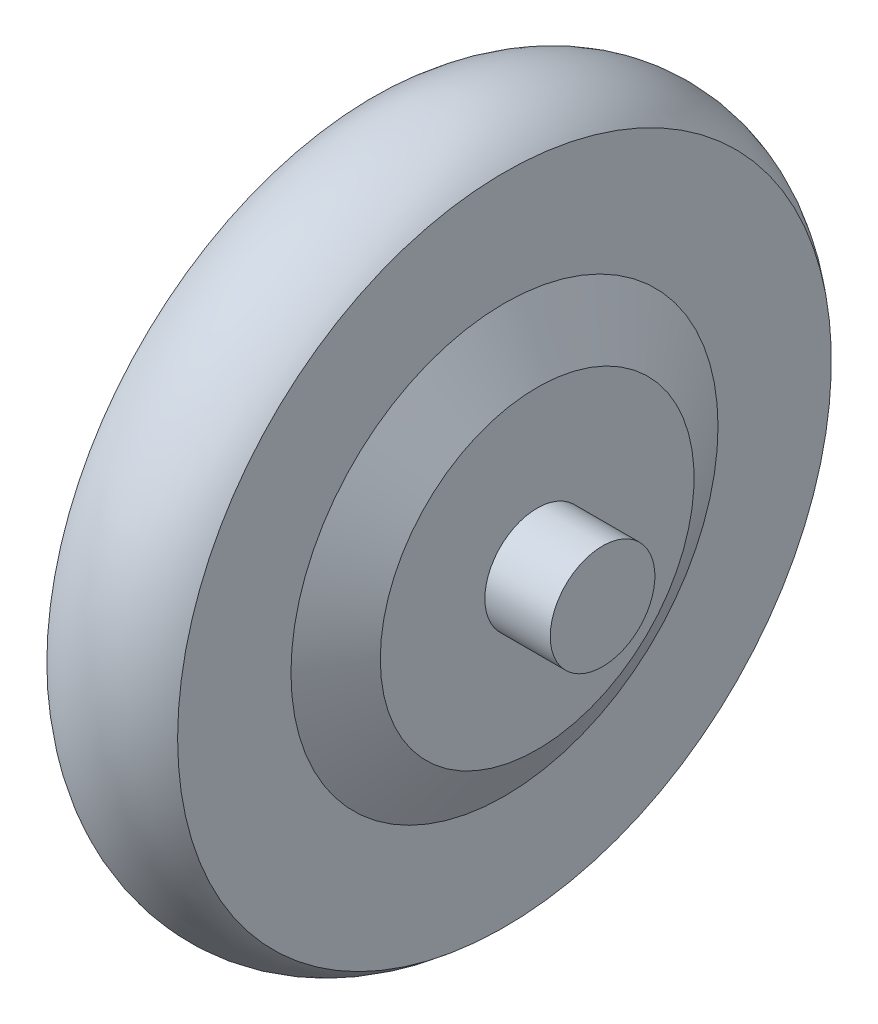
ISO-10303-21;
HEADER;
FILE_DESCRIPTION(('STEP AP214'),'2;1');
FILE_NAME('part.step','',(''),(''),'','','');
FILE_SCHEMA(('AUTOMOTIVE_DESIGN { 1 0 10303 214 1 1 1 1 }'));
ENDSEC;
DATA;
#1=APPLICATION_CONTEXT('core data for automotive mechanical design processes');
#2=APPLICATION_PROTOCOL_DEFINITION('international standard','automotive_design',2000,#1);
#3=PRODUCT_CONTEXT('',#1,'mechanical');
#4=PRODUCT('Part','Part','',(#3));
#5=PRODUCT_RELATED_PRODUCT_CATEGORY('part','',(#4));
#6=PRODUCT_DEFINITION_FORMATION('','',#4);
#7=PRODUCT_DEFINITION_CONTEXT('part definition',#1,'design');
#8=PRODUCT_DEFINITION('design','',#6,#7);
#9=PRODUCT_DEFINITION_SHAPE('','',#8);
#10=(LENGTH_UNIT() NAMED_UNIT(*) SI_UNIT(.MILLI.,.METRE.));
#11=(NAMED_UNIT(*) PLANE_ANGLE_UNIT() SI_UNIT($,.RADIAN.));
#12=(NAMED_UNIT(*) SI_UNIT($,.STERADIAN.) SOLID_ANGLE_UNIT());
#13=UNCERTAINTY_MEASURE_WITH_UNIT(LENGTH_MEASURE(1.E-05),#10,'distance_accuracy_value','');
#14=(GEOMETRIC_REPRESENTATION_CONTEXT(3) GLOBAL_UNCERTAINTY_ASSIGNED_CONTEXT((#13)) GLOBAL_UNIT_ASSIGNED_CONTEXT((#10,
#11,#12)) REPRESENTATION_CONTEXT('',''));
#15=CARTESIAN_POINT('',(0.,0.,0.));
#16=DIRECTION('',(0.,0.,1.));
#17=DIRECTION('',(1.,0.,0.));
#18=AXIS2_PLACEMENT_3D('',#15,#16,#17);
#19=CARTESIAN_POINT('',(0.,0.,0.));
#20=DIRECTION('',(-1.,0.,0.));
#21=DIRECTION('',(0.,0.,1.));
#22=AXIS2_PLACEMENT_3D('',#19,#20,#21);
#23=CYLINDRICAL_SURFACE('',#22,12.);
#24=CARTESIAN_POINT('',(-5.,0.,0.));
#25=DIRECTION('',(-1.,0.,0.));
#26=DIRECTION('',(0.,0.,1.));
#27=AXIS2_PLACEMENT_3D('',#24,#25,#26);
#28=CIRCLE('',#27,12.);
#29=CARTESIAN_POINT('',(-5.,0.,12.));
#30=VERTEX_POINT('',#29);
#31=EDGE_CURVE('E110',#30,#30,#28,.T.);
#32=ORIENTED_EDGE('',*,*,#31,.T.);
#33=EDGE_LOOP('',(#32));
#34=FACE_BOUND('',#33,.T.);
#35=CARTESIAN_POINT('',(-13.,0.,0.));
#36=DIRECTION('',(-1.,0.,0.));
#37=DIRECTION('',(0.,0.,1.));
#38=AXIS2_PLACEMENT_3D('',#35,#36,#37);
#39=CIRCLE('',#38,12.);
#40=CARTESIAN_POINT('',(-13.,0.,12.));
#41=VERTEX_POINT('',#40);
#42=EDGE_CURVE('E107',#41,#41,#39,.T.);
#43=ORIENTED_EDGE('',*,*,#42,.F.);
#44=EDGE_LOOP('',(#43));
#45=FACE_BOUND('',#44,.T.);
#46=CARTESIAN_POINT('',(-6.8,0.,0.));
#47=DIRECTION('',(-1.,0.,0.));
#48=DIRECTION('',(0.,0.,1.));
#49=AXIS2_PLACEMENT_3D('',#46,#47,#48);
#50=CIRCLE('',#49,12.);
#51=CARTESIAN_POINT('',(-6.8,11.3137084989848,4.));
#52=VERTEX_POINT('',#51);
#53=CARTESIAN_POINT('',(-6.8,11.3137084989848,-4.));
#54=VERTEX_POINT('',#53);
#55=EDGE_CURVE('E11',#52,#54,#50,.T.);
#56=ORIENTED_EDGE('',*,*,#55,.F.);
#57=DIRECTION('',(-1.,0.,0.));
#58=VECTOR('',#57,1.);
#59=CARTESIAN_POINT('',(0.,11.3137084989848,4.));
#60=LINE('',#59,#58);
#61=CARTESIAN_POINT('',(-11.2,11.3137084989848,4.));
#62=VERTEX_POINT('',#61);
#63=EDGE_CURVE('E131',#62,#52,#60,.F.);
#64=ORIENTED_EDGE('',*,*,#63,.F.);
#65=CARTESIAN_POINT('',(-11.2,0.,0.));
#66=DIRECTION('',(1.,0.,0.));
#67=DIRECTION('',(0.,0.,-1.));
#68=AXIS2_PLACEMENT_3D('',#65,#66,#67);
#69=CIRCLE('',#68,12.);
#70=CARTESIAN_POINT('',(-11.2,11.3137084989848,-4.));
#71=VERTEX_POINT('',#70);
#72=EDGE_CURVE('E52',#71,#62,#69,.T.);
#73=ORIENTED_EDGE('',*,*,#72,.F.);
#74=DIRECTION('',(-1.,0.,0.));
#75=VECTOR('',#74,1.);
#76=CARTESIAN_POINT('',(0.,11.3137084989848,-4.));
#77=LINE('',#76,#75);
#78=EDGE_CURVE('E42',#54,#71,#77,.T.);
#79=ORIENTED_EDGE('',*,*,#78,.F.);
#80=EDGE_LOOP('',(#56,#64,#73,#79));
#81=FACE_BOUND('',#80,.T.);
#82=ADVANCED_FACE('F34',(#34,#45,#81),#23,.T.);
#83=CARTESIAN_POINT('',(-13.,0.,0.));
#84=DIRECTION('',(1.,0.,0.));
#85=DIRECTION('',(0.,0.,-1.));
#86=AXIS2_PLACEMENT_3D('',#83,#84,#85);
#87=PLANE('',#86);
#88=CARTESIAN_POINT('',(-13.,0.,0.));
#89=DIRECTION('',(1.,0.,0.));
#90=DIRECTION('',(0.,0.,-1.));
#91=AXIS2_PLACEMENT_3D('',#88,#89,#90);
#92=CIRCLE('',#91,8.);
#93=CARTESIAN_POINT('',(-13.,0.,-8.));
#94=VERTEX_POINT('',#93);
#95=EDGE_CURVE('E104',#94,#94,#92,.T.);
#96=ORIENTED_EDGE('',*,*,#95,.T.);
#97=EDGE_LOOP('',(#96));
#98=FACE_BOUND('',#97,.T.);
#99=ORIENTED_EDGE('',*,*,#42,.T.);
#100=EDGE_LOOP('',(#99));
#101=FACE_BOUND('',#100,.T.);
#102=ADVANCED_FACE('F36',(#98,#101),#87,.F.);
#103=CARTESIAN_POINT('',(25.,0.,0.));
#104=DIRECTION('',(-1.,0.,0.));
#105=DIRECTION('',(0.,0.,1.));
#106=AXIS2_PLACEMENT_3D('',#103,#104,#105);
#107=PLANE('',#106);
#108=CARTESIAN_POINT('',(25.,0.,0.));
#109=DIRECTION('',(-1.,0.,0.));
#110=DIRECTION('',(0.,0.,1.));
#111=AXIS2_PLACEMENT_3D('',#108,#109,#110);
#112=CIRCLE('',#111,8.);
#113=CARTESIAN_POINT('',(25.,0.,8.));
#114=VERTEX_POINT('',#113);
#115=EDGE_CURVE('E103',#114,#114,#112,.T.);
#116=ORIENTED_EDGE('',*,*,#115,.T.);
#117=EDGE_LOOP('',(#116));
#118=FACE_BOUND('',#117,.T.);
#119=CARTESIAN_POINT('',(25.,0.,0.));
#120=DIRECTION('',(-1.,0.,0.));
#121=DIRECTION('',(0.,0.,1.));
#122=AXIS2_PLACEMENT_3D('',#119,#120,#121);
#123=CIRCLE('',#122,24.);
#124=CARTESIAN_POINT('',(25.,0.,24.));
#125=VERTEX_POINT('',#124);
#126=EDGE_CURVE('E128',#125,#125,#123,.T.);
#127=ORIENTED_EDGE('',*,*,#126,.F.);
#128=EDGE_LOOP('',(#127));
#129=FACE_BOUND('',#128,.T.);
#130=ADVANCED_FACE('F154',(#118,#129),#107,.F.);
#131=CARTESIAN_POINT('',(25.,0.,0.));
#132=DIRECTION('',(-1.,0.,0.));
#133=DIRECTION('',(0.,0.,1.));
#134=AXIS2_PLACEMENT_3D('',#131,#132,#133);
#135=CONICAL_SURFACE('',#134,24.,1.04719755119659);
#136=CARTESIAN_POINT('',(20.,0.,0.));
#137=DIRECTION('',(-1.,0.,0.));
#138=DIRECTION('',(0.,0.,1.));
#139=AXIS2_PLACEMENT_3D('',#136,#137,#138);
#140=CIRCLE('',#139,32.6602540378443);
#141=CARTESIAN_POINT('',(20.,0.,32.6602540378443));
#142=VERTEX_POINT('',#141);
#143=EDGE_CURVE('E125',#142,#142,#140,.T.);
#144=ORIENTED_EDGE('',*,*,#143,.F.);
#145=EDGE_LOOP('',(#144));
#146=FACE_BOUND('',#145,.T.);
#147=ORIENTED_EDGE('',*,*,#126,.T.);
#148=EDGE_LOOP('',(#147));
#149=FACE_BOUND('',#148,.T.);
#150=ADVANCED_FACE('F181',(#146,#149),#135,.T.);
#151=CARTESIAN_POINT('',(20.,32.6602540378443,0.));
#152=DIRECTION('',(-1.,0.,0.));
#153=DIRECTION('',(0.,0.,1.));
#154=AXIS2_PLACEMENT_3D('',#151,#152,#153);
#155=PLANE('',#154);
#156=CARTESIAN_POINT('',(20.,0.,0.));
#157=DIRECTION('',(-1.,0.,0.));
#158=DIRECTION('',(0.,0.,1.));
#159=AXIS2_PLACEMENT_3D('',#156,#157,#158);
#160=CIRCLE('',#159,50.);
#161=CARTESIAN_POINT('',(20.,0.,50.));
#162=VERTEX_POINT('',#161);
#163=EDGE_CURVE('E122',#162,#162,#160,.T.);
#164=ORIENTED_EDGE('',*,*,#163,.F.);
#165=EDGE_LOOP('',(#164));
#166=FACE_BOUND('',#165,.T.);
#167=ORIENTED_EDGE('',*,*,#143,.T.);
#168=EDGE_LOOP('',(#167));
#169=FACE_BOUND('',#168,.T.);
#170=ADVANCED_FACE('F177',(#166,#169),#155,.F.);
#171=CARTESIAN_POINT('',(10.,0.,0.));
#172=DIRECTION('',(-1.,0.,0.));
#173=DIRECTION('',(0.,0.,1.));
#174=AXIS2_PLACEMENT_3D('',#171,#172,#173);
#175=TOROIDAL_SURFACE('',#174,38.8196601125011,15.);
#176=CARTESIAN_POINT('',(0.,0.,0.));
#177=DIRECTION('',(-1.,0.,0.));
#178=DIRECTION('',(0.,0.,1.));
#179=AXIS2_PLACEMENT_3D('',#176,#177,#178);
#180=CIRCLE('',#179,50.);
#181=CARTESIAN_POINT('',(0.,0.,50.));
#182=VERTEX_POINT('',#181);
#183=EDGE_CURVE('E119',#182,#182,#180,.T.);
#184=ORIENTED_EDGE('',*,*,#183,.F.);
#185=EDGE_LOOP('',(#184));
#186=FACE_BOUND('',#185,.T.);
#187=ORIENTED_EDGE('',*,*,#163,.T.);
#188=EDGE_LOOP('',(#187));
#189=FACE_BOUND('',#188,.T.);
#190=ADVANCED_FACE('F173',(#186,#189),#175,.T.);
#191=CARTESIAN_POINT('',(0.,32.6602540378443,0.));
#192=DIRECTION('',(1.,0.,0.));
#193=DIRECTION('',(0.,0.,-1.));
#194=AXIS2_PLACEMENT_3D('',#191,#192,#193);
#195=PLANE('',#194);
#196=CARTESIAN_POINT('',(0.,0.,0.));
#197=DIRECTION('',(-1.,0.,0.));
#198=DIRECTION('',(0.,0.,1.));
#199=AXIS2_PLACEMENT_3D('',#196,#197,#198);
#200=CIRCLE('',#199,32.6602540378443);
#201=CARTESIAN_POINT('',(0.,0.,32.6602540378443));
#202=VERTEX_POINT('',#201);
#203=EDGE_CURVE('E116',#202,#202,#200,.T.);
#204=ORIENTED_EDGE('',*,*,#203,.F.);
#205=EDGE_LOOP('',(#204));
#206=FACE_BOUND('',#205,.T.);
#207=ORIENTED_EDGE('',*,*,#183,.T.);
#208=EDGE_LOOP('',(#207));
#209=FACE_BOUND('',#208,.T.);
#210=ADVANCED_FACE('F169',(#206,#209),#195,.F.);
#211=CARTESIAN_POINT('',(0.,0.,0.));
#212=DIRECTION('',(1.,0.,0.));
#213=DIRECTION('',(0.,0.,-1.));
#214=AXIS2_PLACEMENT_3D('',#211,#212,#213);
#215=CONICAL_SURFACE('',#214,32.6602540378443,1.04719755119659);
#216=CARTESIAN_POINT('',(-5.,0.,0.));
#217=DIRECTION('',(-1.,0.,0.));
#218=DIRECTION('',(0.,0.,1.));
#219=AXIS2_PLACEMENT_3D('',#216,#217,#218);
#220=CIRCLE('',#219,24.);
#221=CARTESIAN_POINT('',(-5.,0.,24.));
#222=VERTEX_POINT('',#221);
#223=EDGE_CURVE('E113',#222,#222,#220,.T.);
#224=ORIENTED_EDGE('',*,*,#223,.F.);
#225=EDGE_LOOP('',(#224));
#226=FACE_BOUND('',#225,.T.);
#227=ORIENTED_EDGE('',*,*,#203,.T.);
#228=EDGE_LOOP('',(#227));
#229=FACE_BOUND('',#228,.T.);
#230=ADVANCED_FACE('F165',(#226,#229),#215,.T.);
#231=CARTESIAN_POINT('',(-5.,12.,0.));
#232=DIRECTION('',(1.,0.,0.));
#233=DIRECTION('',(0.,0.,-1.));
#234=AXIS2_PLACEMENT_3D('',#231,#232,#233);
#235=PLANE('',#234);
#236=ORIENTED_EDGE('',*,*,#31,.F.);
#237=EDGE_LOOP('',(#236));
#238=FACE_BOUND('',#237,.T.);
#239=ORIENTED_EDGE('',*,*,#223,.T.);
#240=EDGE_LOOP('',(#239));
#241=FACE_BOUND('',#240,.T.);
#242=ADVANCED_FACE('F161',(#238,#241),#235,.F.);
#243=CARTESIAN_POINT('',(35.,0.,0.));
#244=DIRECTION('',(-1.,0.,0.));
#245=DIRECTION('',(0.,0.,1.));
#246=AXIS2_PLACEMENT_3D('',#243,#244,#245);
#247=PLANE('',#246);
#248=CARTESIAN_POINT('',(35.,0.,0.));
#249=DIRECTION('',(-1.,0.,0.));
#250=DIRECTION('',(0.,0.,1.));
#251=AXIS2_PLACEMENT_3D('',#248,#249,#250);
#252=CIRCLE('',#251,8.);
#253=CARTESIAN_POINT('',(35.,0.,8.));
#254=VERTEX_POINT('',#253);
#255=EDGE_CURVE('E95',#254,#254,#252,.T.);
#256=ORIENTED_EDGE('',*,*,#255,.F.);
#257=EDGE_LOOP('',(#256));
#258=FACE_BOUND('',#257,.T.);
#259=ADVANCED_FACE('F164',(#258),#247,.F.);
#260=CARTESIAN_POINT('',(35.,0.,0.));
#261=DIRECTION('',(-1.,0.,0.));
#262=DIRECTION('',(0.,0.,1.));
#263=AXIS2_PLACEMENT_3D('',#260,#261,#262);
#264=CYLINDRICAL_SURFACE('',#263,8.);
#265=ORIENTED_EDGE('',*,*,#255,.T.);
#266=EDGE_LOOP('',(#265));
#267=FACE_BOUND('',#266,.T.);
#268=ORIENTED_EDGE('',*,*,#115,.F.);
#269=EDGE_LOOP('',(#268));
#270=FACE_BOUND('',#269,.T.);
#271=ADVANCED_FACE('F195',(#267,#270),#264,.T.);
#272=CARTESIAN_POINT('',(-23.,0.,0.));
#273=DIRECTION('',(-1.,0.,0.));
#274=DIRECTION('',(0.,0.,1.));
#275=AXIS2_PLACEMENT_3D('',#272,#273,#274);
#276=CIRCLE('',#275,8.);
#277=CARTESIAN_POINT('',(-23.,0.,8.));
#278=VERTEX_POINT('',#277);
#279=EDGE_CURVE('E92',#278,#278,#276,.T.);
#280=ORIENTED_EDGE('',*,*,#279,.F.);
#281=EDGE_LOOP('',(#280));
#282=FACE_BOUND('',#281,.T.);
#283=ORIENTED_EDGE('',*,*,#95,.F.);
#284=EDGE_LOOP('',(#283));
#285=FACE_BOUND('',#284,.T.);
#286=ADVANCED_FACE('F159',(#282,#285),#264,.T.);
#287=CARTESIAN_POINT('',(-23.,0.,0.));
#288=DIRECTION('',(-1.,0.,0.));
#289=DIRECTION('',(0.,0.,1.));
#290=AXIS2_PLACEMENT_3D('',#287,#288,#289);
#291=PLANE('',#290);
#292=ORIENTED_EDGE('',*,*,#279,.T.);
#293=EDGE_LOOP('',(#292));
#294=FACE_BOUND('',#293,.T.);
#295=ADVANCED_FACE('F202',(#294),#291,.T.);
#296=CARTESIAN_POINT('',(-11.2,14.,-4.));
#297=DIRECTION('',(0.,0.,1.));
#298=DIRECTION('',(1.,0.,0.));
#299=AXIS2_PLACEMENT_3D('',#296,#297,#298);
#300=PLANE('',#299);
#301=DIRECTION('',(0.,-1.,0.));
#302=VECTOR('',#301,1.);
#303=CARTESIAN_POINT('',(-6.8,14.,-4.));
#304=LINE('',#303,#302);
#305=CARTESIAN_POINT('',(-6.8,14.,-4.));
#306=VERTEX_POINT('',#305);
#307=EDGE_CURVE('E75',#306,#54,#304,.T.);
#308=ORIENTED_EDGE('',*,*,#307,.T.);
#309=ORIENTED_EDGE('',*,*,#78,.T.);
#310=DIRECTION('',(0.,-1.,0.));
#311=VECTOR('',#310,1.);
#312=CARTESIAN_POINT('',(-11.2,14.,-4.));
#313=LINE('',#312,#311);
#314=CARTESIAN_POINT('',(-11.2,14.,-4.));
#315=VERTEX_POINT('',#314);
#316=EDGE_CURVE('E77',#315,#71,#313,.T.);
#317=ORIENTED_EDGE('',*,*,#316,.F.);
#318=DIRECTION('',(-1.,0.,0.));
#319=VECTOR('',#318,1.);
#320=CARTESIAN_POINT('',(-11.2,14.,-4.));
#321=LINE('',#320,#319);
#322=EDGE_CURVE('E71',#306,#315,#321,.T.);
#323=ORIENTED_EDGE('',*,*,#322,.F.);
#324=EDGE_LOOP('',(#308,#309,#317,#323));
#325=FACE_BOUND('',#324,.T.);
#326=ADVANCED_FACE('F73',(#325),#300,.F.);
#327=CARTESIAN_POINT('',(-6.8,14.,4.));
#328=DIRECTION('',(0.,0.,-1.));
#329=DIRECTION('',(-1.,0.,0.));
#330=AXIS2_PLACEMENT_3D('',#327,#328,#329);
#331=PLANE('',#330);
#332=DIRECTION('',(0.,-1.,0.));
#333=VECTOR('',#332,1.);
#334=CARTESIAN_POINT('',(-11.2,14.,4.));
#335=LINE('',#334,#333);
#336=CARTESIAN_POINT('',(-11.2,14.,4.));
#337=VERTEX_POINT('',#336);
#338=EDGE_CURVE('E97',#337,#62,#335,.T.);
#339=ORIENTED_EDGE('',*,*,#338,.T.);
#340=ORIENTED_EDGE('',*,*,#63,.T.);
#341=DIRECTION('',(0.,-1.,0.));
#342=VECTOR('',#341,1.);
#343=CARTESIAN_POINT('',(-6.8,14.,4.));
#344=LINE('',#343,#342);
#345=CARTESIAN_POINT('',(-6.8,14.,4.));
#346=VERTEX_POINT('',#345);
#347=EDGE_CURVE('E141',#346,#52,#344,.T.);
#348=ORIENTED_EDGE('',*,*,#347,.F.);
#349=DIRECTION('',(1.,0.,0.));
#350=VECTOR('',#349,1.);
#351=CARTESIAN_POINT('',(-6.8,14.,4.));
#352=LINE('',#351,#350);
#353=EDGE_CURVE('E86',#337,#346,#352,.T.);
#354=ORIENTED_EDGE('',*,*,#353,.F.);
#355=EDGE_LOOP('',(#339,#340,#348,#354));
#356=FACE_BOUND('',#355,.T.);
#357=ADVANCED_FACE('F145',(#356),#331,.F.);
#358=CARTESIAN_POINT('',(-6.8,14.,-4.));
#359=DIRECTION('',(-1.,0.,0.));
#360=DIRECTION('',(0.,0.,1.));
#361=AXIS2_PLACEMENT_3D('',#358,#359,#360);
#362=PLANE('',#361);
#363=ORIENTED_EDGE('',*,*,#347,.T.);
#364=ORIENTED_EDGE('',*,*,#55,.T.);
#365=ORIENTED_EDGE('',*,*,#307,.F.);
#366=DIRECTION('',(0.,0.,-1.));
#367=VECTOR('',#366,1.);
#368=CARTESIAN_POINT('',(-6.8,14.,-4.));
#369=LINE('',#368,#367);
#370=EDGE_CURVE('E81',#346,#306,#369,.T.);
#371=ORIENTED_EDGE('',*,*,#370,.F.);
#372=EDGE_LOOP('',(#363,#364,#365,#371));
#373=FACE_BOUND('',#372,.T.);
#374=ADVANCED_FACE('F91',(#373),#362,.F.);
#375=CARTESIAN_POINT('',(-11.2,14.,-4.));
#376=DIRECTION('',(1.,0.,0.));
#377=DIRECTION('',(0.,0.,-1.));
#378=AXIS2_PLACEMENT_3D('',#375,#376,#377);
#379=PLANE('',#378);
#380=ORIENTED_EDGE('',*,*,#316,.T.);
#381=ORIENTED_EDGE('',*,*,#72,.T.);
#382=ORIENTED_EDGE('',*,*,#338,.F.);
#383=DIRECTION('',(0.,0.,1.));
#384=VECTOR('',#383,1.);
#385=CARTESIAN_POINT('',(-11.2,14.,-4.));
#386=LINE('',#385,#384);
#387=EDGE_CURVE('E80',#315,#337,#386,.T.);
#388=ORIENTED_EDGE('',*,*,#387,.F.);
#389=EDGE_LOOP('',(#380,#381,#382,#388));
#390=FACE_BOUND('',#389,.T.);
#391=ADVANCED_FACE('F137',(#390),#379,.F.);
#392=CARTESIAN_POINT('',(0.,14.,0.));
#393=DIRECTION('',(0.,-1.,0.));
#394=DIRECTION('',(0.,0.,-1.));
#395=AXIS2_PLACEMENT_3D('',#392,#393,#394);
#396=PLANE('',#395);
#397=ORIENTED_EDGE('',*,*,#370,.T.);
#398=ORIENTED_EDGE('',*,*,#322,.T.);
#399=ORIENTED_EDGE('',*,*,#387,.T.);
#400=ORIENTED_EDGE('',*,*,#353,.T.);
#401=EDGE_LOOP('',(#397,#398,#399,#400));
#402=FACE_BOUND('',#401,.T.);
#403=ADVANCED_FACE('F84',(#402),#396,.F.);
#404=CLOSED_SHELL('',(#82,#102,#130,#150,#170,#190,#210,#230,#242,#259,#271,#286,#295,#326,#357,
#374,#391,#403));
#405=MANIFOLD_SOLID_BREP('B2',#404);
#406=ADVANCED_BREP_SHAPE_REPRESENTATION('',(#18,#405),#14);
#407=SHAPE_DEFINITION_REPRESENTATION(#9,#406);
ENDSEC;
END-ISO-10303-21;
